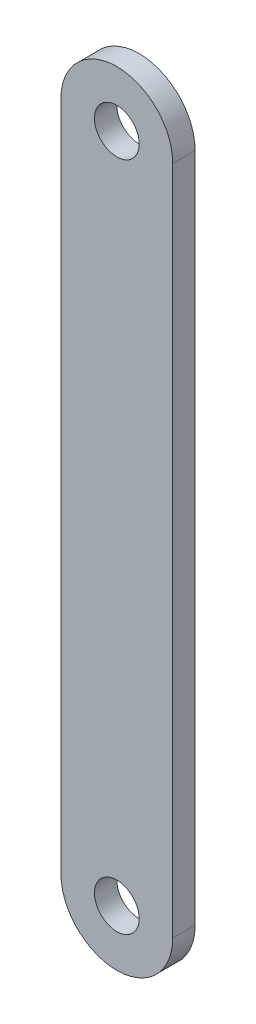
ISO-10303-21;
HEADER;
FILE_DESCRIPTION(('STEP AP214'),'2;1');
FILE_NAME('part.step','',(''),(''),'','','');
FILE_SCHEMA(('AUTOMOTIVE_DESIGN { 1 0 10303 214 1 1 1 1 }'));
ENDSEC;
DATA;
#1=APPLICATION_CONTEXT('core data for automotive mechanical design processes');
#2=APPLICATION_PROTOCOL_DEFINITION('international standard','automotive_design',2000,#1);
#3=PRODUCT_CONTEXT('',#1,'mechanical');
#4=PRODUCT('Part','Part','',(#3));
#5=PRODUCT_RELATED_PRODUCT_CATEGORY('part','',(#4));
#6=PRODUCT_DEFINITION_FORMATION('','',#4);
#7=PRODUCT_DEFINITION_CONTEXT('part definition',#1,'design');
#8=PRODUCT_DEFINITION('design','',#6,#7);
#9=PRODUCT_DEFINITION_SHAPE('','',#8);
#10=(LENGTH_UNIT() NAMED_UNIT(*) SI_UNIT(.MILLI.,.METRE.));
#11=(NAMED_UNIT(*) PLANE_ANGLE_UNIT() SI_UNIT($,.RADIAN.));
#12=(NAMED_UNIT(*) SI_UNIT($,.STERADIAN.) SOLID_ANGLE_UNIT());
#13=UNCERTAINTY_MEASURE_WITH_UNIT(LENGTH_MEASURE(1.E-05),#10,'distance_accuracy_value','');
#14=(GEOMETRIC_REPRESENTATION_CONTEXT(3) GLOBAL_UNCERTAINTY_ASSIGNED_CONTEXT((#13)) GLOBAL_UNIT_ASSIGNED_CONTEXT((#10,
#11,#12)) REPRESENTATION_CONTEXT('',''));
#15=CARTESIAN_POINT('',(0.,0.,0.));
#16=DIRECTION('',(0.,0.,1.));
#17=DIRECTION('',(1.,0.,0.));
#18=AXIS2_PLACEMENT_3D('',#15,#16,#17);
#19=CARTESIAN_POINT('',(25.,0.,10.));
#20=DIRECTION('',(0.,0.,1.));
#21=DIRECTION('',(1.,0.,0.));
#22=AXIS2_PLACEMENT_3D('',#19,#20,#21);
#23=PLANE('',#22);
#24=CARTESIAN_POINT('',(25.,300.,10.));
#25=DIRECTION('',(0.,0.,1.));
#26=DIRECTION('',(1.,0.,0.));
#27=AXIS2_PLACEMENT_3D('',#24,#25,#26);
#28=CIRCLE('',#27,10.);
#29=CARTESIAN_POINT('',(35.,300.,10.));
#30=VERTEX_POINT('',#29);
#31=EDGE_CURVE('E100',#30,#30,#28,.T.);
#32=ORIENTED_EDGE('',*,*,#31,.F.);
#33=EDGE_LOOP('',(#32));
#34=FACE_BOUND('',#33,.T.);
#35=CARTESIAN_POINT('',(25.,0.,10.));
#36=DIRECTION('',(0.,0.,1.));
#37=DIRECTION('',(1.,0.,0.));
#38=AXIS2_PLACEMENT_3D('',#35,#36,#37);
#39=CIRCLE('',#38,25.);
#40=CARTESIAN_POINT('',(0.,0.,10.));
#41=VERTEX_POINT('',#40);
#42=CARTESIAN_POINT('',(50.,0.,10.));
#43=VERTEX_POINT('',#42);
#44=EDGE_CURVE('E85',#41,#43,#39,.T.);
#45=ORIENTED_EDGE('',*,*,#44,.T.);
#46=DIRECTION('',(0.,1.,0.));
#47=VECTOR('',#46,1.);
#48=CARTESIAN_POINT('',(50.,0.,10.));
#49=LINE('',#48,#47);
#50=CARTESIAN_POINT('',(50.,300.,10.));
#51=VERTEX_POINT('',#50);
#52=EDGE_CURVE('E80',#43,#51,#49,.T.);
#53=ORIENTED_EDGE('',*,*,#52,.T.);
#54=CARTESIAN_POINT('',(25.,300.,10.));
#55=DIRECTION('',(0.,0.,1.));
#56=DIRECTION('',(1.,0.,0.));
#57=AXIS2_PLACEMENT_3D('',#54,#55,#56);
#58=CIRCLE('',#57,25.);
#59=CARTESIAN_POINT('',(0.,300.,10.));
#60=VERTEX_POINT('',#59);
#61=EDGE_CURVE('E83',#51,#60,#58,.T.);
#62=ORIENTED_EDGE('',*,*,#61,.T.);
#63=DIRECTION('',(0.,-1.,0.));
#64=VECTOR('',#63,1.);
#65=CARTESIAN_POINT('',(0.,300.,10.));
#66=LINE('',#65,#64);
#67=EDGE_CURVE('E50',#60,#41,#66,.T.);
#68=ORIENTED_EDGE('',*,*,#67,.T.);
#69=EDGE_LOOP('',(#45,#53,#62,#68));
#70=FACE_BOUND('',#69,.T.);
#71=CARTESIAN_POINT('',(25.,0.,10.));
#72=DIRECTION('',(0.,0.,1.));
#73=DIRECTION('',(1.,0.,0.));
#74=AXIS2_PLACEMENT_3D('',#71,#72,#73);
#75=CIRCLE('',#74,10.);
#76=CARTESIAN_POINT('',(35.,0.,10.));
#77=VERTEX_POINT('',#76);
#78=EDGE_CURVE('E115',#77,#77,#75,.T.);
#79=ORIENTED_EDGE('',*,*,#78,.F.);
#80=EDGE_LOOP('',(#79));
#81=FACE_BOUND('',#80,.T.);
#82=ADVANCED_FACE('F33',(#34,#70,#81),#23,.T.);
#83=CARTESIAN_POINT('',(25.,0.,0.));
#84=DIRECTION('',(0.,0.,1.));
#85=DIRECTION('',(1.,0.,0.));
#86=AXIS2_PLACEMENT_3D('',#83,#84,#85);
#87=PLANE('',#86);
#88=CARTESIAN_POINT('',(25.,300.,0.));
#89=DIRECTION('',(0.,0.,1.));
#90=DIRECTION('',(1.,0.,0.));
#91=AXIS2_PLACEMENT_3D('',#88,#89,#90);
#92=CIRCLE('',#91,10.);
#93=CARTESIAN_POINT('',(35.,300.,0.));
#94=VERTEX_POINT('',#93);
#95=EDGE_CURVE('E112',#94,#94,#92,.T.);
#96=ORIENTED_EDGE('',*,*,#95,.T.);
#97=EDGE_LOOP('',(#96));
#98=FACE_BOUND('',#97,.T.);
#99=CARTESIAN_POINT('',(25.,0.,0.));
#100=DIRECTION('',(0.,0.,1.));
#101=DIRECTION('',(1.,0.,0.));
#102=AXIS2_PLACEMENT_3D('',#99,#100,#101);
#103=CIRCLE('',#102,25.);
#104=CARTESIAN_POINT('',(0.,0.,0.));
#105=VERTEX_POINT('',#104);
#106=CARTESIAN_POINT('',(50.,0.,0.));
#107=VERTEX_POINT('',#106);
#108=EDGE_CURVE('E97',#105,#107,#103,.T.);
#109=ORIENTED_EDGE('',*,*,#108,.F.);
#110=DIRECTION('',(0.,-1.,0.));
#111=VECTOR('',#110,1.);
#112=CARTESIAN_POINT('',(0.,300.,0.));
#113=LINE('',#112,#111);
#114=CARTESIAN_POINT('',(0.,300.,0.));
#115=VERTEX_POINT('',#114);
#116=EDGE_CURVE('E73',#115,#105,#113,.T.);
#117=ORIENTED_EDGE('',*,*,#116,.F.);
#118=CARTESIAN_POINT('',(25.,300.,0.));
#119=DIRECTION('',(0.,0.,1.));
#120=DIRECTION('',(1.,0.,0.));
#121=AXIS2_PLACEMENT_3D('',#118,#119,#120);
#122=CIRCLE('',#121,25.);
#123=CARTESIAN_POINT('',(50.,300.,0.));
#124=VERTEX_POINT('',#123);
#125=EDGE_CURVE('E67',#124,#115,#122,.T.);
#126=ORIENTED_EDGE('',*,*,#125,.F.);
#127=DIRECTION('',(0.,1.,0.));
#128=VECTOR('',#127,1.);
#129=CARTESIAN_POINT('',(50.,0.,0.));
#130=LINE('',#129,#128);
#131=EDGE_CURVE('E89',#107,#124,#130,.T.);
#132=ORIENTED_EDGE('',*,*,#131,.F.);
#133=EDGE_LOOP('',(#109,#117,#126,#132));
#134=FACE_BOUND('',#133,.T.);
#135=CARTESIAN_POINT('',(25.,0.,0.));
#136=DIRECTION('',(0.,0.,1.));
#137=DIRECTION('',(1.,0.,0.));
#138=AXIS2_PLACEMENT_3D('',#135,#136,#137);
#139=CIRCLE('',#138,10.);
#140=CARTESIAN_POINT('',(35.,0.,0.));
#141=VERTEX_POINT('',#140);
#142=EDGE_CURVE('E118',#141,#141,#139,.T.);
#143=ORIENTED_EDGE('',*,*,#142,.T.);
#144=EDGE_LOOP('',(#143));
#145=FACE_BOUND('',#144,.T.);
#146=ADVANCED_FACE('F108',(#98,#134,#145),#87,.F.);
#147=CARTESIAN_POINT('',(25.,0.,10.));
#148=DIRECTION('',(0.,0.,-1.));
#149=DIRECTION('',(-1.,0.,0.));
#150=AXIS2_PLACEMENT_3D('',#147,#148,#149);
#151=CYLINDRICAL_SURFACE('',#150,25.);
#152=ORIENTED_EDGE('',*,*,#108,.T.);
#153=DIRECTION('',(0.,0.,-1.));
#154=VECTOR('',#153,1.);
#155=CARTESIAN_POINT('',(50.,0.,10.));
#156=LINE('',#155,#154);
#157=EDGE_CURVE('E11',#43,#107,#156,.T.);
#158=ORIENTED_EDGE('',*,*,#157,.F.);
#159=ORIENTED_EDGE('',*,*,#44,.F.);
#160=DIRECTION('',(0.,0.,-1.));
#161=VECTOR('',#160,1.);
#162=CARTESIAN_POINT('',(0.,0.,10.));
#163=LINE('',#162,#161);
#164=EDGE_CURVE('E93',#41,#105,#163,.T.);
#165=ORIENTED_EDGE('',*,*,#164,.T.);
#166=EDGE_LOOP('',(#152,#158,#159,#165));
#167=FACE_BOUND('',#166,.T.);
#168=ADVANCED_FACE('F35',(#167),#151,.T.);
#169=CARTESIAN_POINT('',(50.,0.,10.));
#170=DIRECTION('',(-1.,0.,0.));
#171=DIRECTION('',(0.,0.,1.));
#172=AXIS2_PLACEMENT_3D('',#169,#170,#171);
#173=PLANE('',#172);
#174=ORIENTED_EDGE('',*,*,#131,.T.);
#175=DIRECTION('',(0.,0.,-1.));
#176=VECTOR('',#175,1.);
#177=CARTESIAN_POINT('',(50.,300.,10.));
#178=LINE('',#177,#176);
#179=EDGE_CURVE('E42',#51,#124,#178,.T.);
#180=ORIENTED_EDGE('',*,*,#179,.F.);
#181=ORIENTED_EDGE('',*,*,#52,.F.);
#182=ORIENTED_EDGE('',*,*,#157,.T.);
#183=EDGE_LOOP('',(#174,#180,#181,#182));
#184=FACE_BOUND('',#183,.T.);
#185=ADVANCED_FACE('F88',(#184),#173,.F.);
#186=CARTESIAN_POINT('',(25.,300.,10.));
#187=DIRECTION('',(0.,0.,-1.));
#188=DIRECTION('',(-1.,0.,0.));
#189=AXIS2_PLACEMENT_3D('',#186,#187,#188);
#190=CYLINDRICAL_SURFACE('',#189,25.);
#191=ORIENTED_EDGE('',*,*,#125,.T.);
#192=DIRECTION('',(0.,0.,-1.));
#193=VECTOR('',#192,1.);
#194=CARTESIAN_POINT('',(0.,300.,10.));
#195=LINE('',#194,#193);
#196=EDGE_CURVE('E90',#60,#115,#195,.T.);
#197=ORIENTED_EDGE('',*,*,#196,.F.);
#198=ORIENTED_EDGE('',*,*,#61,.F.);
#199=ORIENTED_EDGE('',*,*,#179,.T.);
#200=EDGE_LOOP('',(#191,#197,#198,#199));
#201=FACE_BOUND('',#200,.T.);
#202=ADVANCED_FACE('F91',(#201),#190,.T.);
#203=CARTESIAN_POINT('',(0.,300.,10.));
#204=DIRECTION('',(1.,0.,0.));
#205=DIRECTION('',(0.,0.,-1.));
#206=AXIS2_PLACEMENT_3D('',#203,#204,#205);
#207=PLANE('',#206);
#208=ORIENTED_EDGE('',*,*,#116,.T.);
#209=ORIENTED_EDGE('',*,*,#164,.F.);
#210=ORIENTED_EDGE('',*,*,#67,.F.);
#211=ORIENTED_EDGE('',*,*,#196,.T.);
#212=EDGE_LOOP('',(#208,#209,#210,#211));
#213=FACE_BOUND('',#212,.T.);
#214=ADVANCED_FACE('F105',(#213),#207,.F.);
#215=CARTESIAN_POINT('',(25.,300.,10.));
#216=DIRECTION('',(0.,0.,-1.));
#217=DIRECTION('',(-1.,0.,0.));
#218=AXIS2_PLACEMENT_3D('',#215,#216,#217);
#219=CYLINDRICAL_SURFACE('',#218,10.);
#220=ORIENTED_EDGE('',*,*,#31,.T.);
#221=EDGE_LOOP('',(#220));
#222=FACE_BOUND('',#221,.T.);
#223=ORIENTED_EDGE('',*,*,#95,.F.);
#224=EDGE_LOOP('',(#223));
#225=FACE_BOUND('',#224,.T.);
#226=ADVANCED_FACE('F136',(#222,#225),#219,.F.);
#227=CARTESIAN_POINT('',(25.,0.,10.));
#228=DIRECTION('',(0.,0.,-1.));
#229=DIRECTION('',(-1.,0.,0.));
#230=AXIS2_PLACEMENT_3D('',#227,#228,#229);
#231=CYLINDRICAL_SURFACE('',#230,10.);
#232=ORIENTED_EDGE('',*,*,#78,.T.);
#233=EDGE_LOOP('',(#232));
#234=FACE_BOUND('',#233,.T.);
#235=ORIENTED_EDGE('',*,*,#142,.F.);
#236=EDGE_LOOP('',(#235));
#237=FACE_BOUND('',#236,.T.);
#238=ADVANCED_FACE('F124',(#234,#237),#231,.F.);
#239=CLOSED_SHELL('',(#82,#146,#168,#185,#202,#214,#226,#238));
#240=MANIFOLD_SOLID_BREP('B2',#239);
#241=ADVANCED_BREP_SHAPE_REPRESENTATION('',(#18,#240),#14);
#242=SHAPE_DEFINITION_REPRESENTATION(#9,#241);
ENDSEC;
END-ISO-10303-21;
